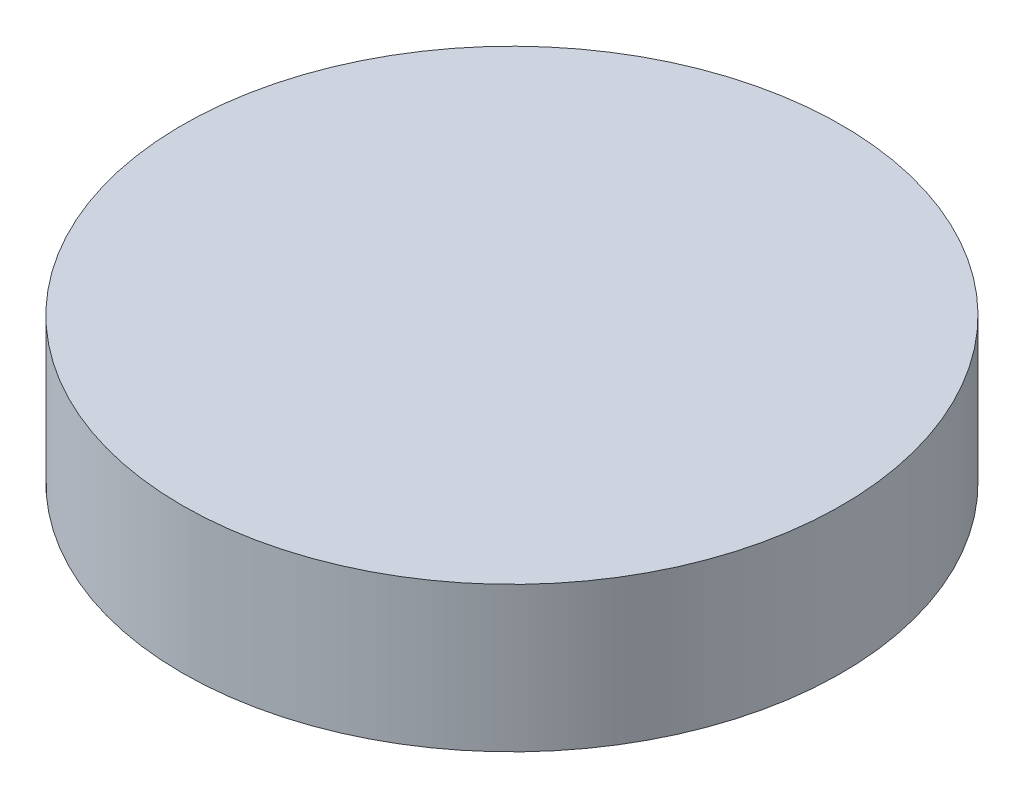
ISO-10303-21;
HEADER;
FILE_DESCRIPTION(('STEP AP214'),'2;1');
FILE_NAME('part.step','',(''),(''),'','','');
FILE_SCHEMA(('AUTOMOTIVE_DESIGN { 1 0 10303 214 1 1 1 1 }'));
ENDSEC;
DATA;
#1=APPLICATION_CONTEXT('core data for automotive mechanical design processes');
#2=APPLICATION_PROTOCOL_DEFINITION('international standard','automotive_design',2000,#1);
#3=PRODUCT_CONTEXT('',#1,'mechanical');
#4=PRODUCT('Part','Part','',(#3));
#5=PRODUCT_RELATED_PRODUCT_CATEGORY('part','',(#4));
#6=PRODUCT_DEFINITION_FORMATION('','',#4);
#7=PRODUCT_DEFINITION_CONTEXT('part definition',#1,'design');
#8=PRODUCT_DEFINITION('design','',#6,#7);
#9=PRODUCT_DEFINITION_SHAPE('','',#8);
#10=(LENGTH_UNIT() NAMED_UNIT(*) SI_UNIT(.MILLI.,.METRE.));
#11=(NAMED_UNIT(*) PLANE_ANGLE_UNIT() SI_UNIT($,.RADIAN.));
#12=(NAMED_UNIT(*) SI_UNIT($,.STERADIAN.) SOLID_ANGLE_UNIT());
#13=UNCERTAINTY_MEASURE_WITH_UNIT(LENGTH_MEASURE(1.E-05),#10,'distance_accuracy_value','');
#14=(GEOMETRIC_REPRESENTATION_CONTEXT(3) GLOBAL_UNCERTAINTY_ASSIGNED_CONTEXT((#13)) GLOBAL_UNIT_ASSIGNED_CONTEXT((#10,
#11,#12)) REPRESENTATION_CONTEXT('',''));
#15=CARTESIAN_POINT('',(0.,0.,0.));
#16=DIRECTION('',(0.,0.,1.));
#17=DIRECTION('',(1.,0.,0.));
#18=AXIS2_PLACEMENT_3D('',#15,#16,#17);
#19=CARTESIAN_POINT('',(0.,32.,0.));
#20=DIRECTION('',(0.,-1.,0.));
#21=DIRECTION('',(0.,0.,-1.));
#22=AXIS2_PLACEMENT_3D('',#19,#20,#21);
#23=CYLINDRICAL_SURFACE('',#22,72.7);
#24=CARTESIAN_POINT('',(0.,32.,0.));
#25=DIRECTION('',(0.,1.,0.));
#26=DIRECTION('',(0.,0.,1.));
#27=AXIS2_PLACEMENT_3D('',#24,#25,#26);
#28=CIRCLE('',#27,72.7);
#29=CARTESIAN_POINT('',(0.,32.,72.7));
#30=VERTEX_POINT('',#29);
#31=EDGE_CURVE('E10',#30,#30,#28,.T.);
#32=ORIENTED_EDGE('',*,*,#31,.F.);
#33=EDGE_LOOP('',(#32));
#34=FACE_BOUND('',#33,.T.);
#35=CARTESIAN_POINT('',(0.,0.,0.));
#36=DIRECTION('',(0.,1.,0.));
#37=DIRECTION('',(0.,0.,1.));
#38=AXIS2_PLACEMENT_3D('',#35,#36,#37);
#39=CIRCLE('',#38,72.7);
#40=CARTESIAN_POINT('',(0.,0.,72.7));
#41=VERTEX_POINT('',#40);
#42=EDGE_CURVE('E37',#41,#41,#39,.T.);
#43=ORIENTED_EDGE('',*,*,#42,.T.);
#44=EDGE_LOOP('',(#43));
#45=FACE_BOUND('',#44,.T.);
#46=ADVANCED_FACE('F34',(#34,#45),#23,.T.);
#47=CARTESIAN_POINT('',(0.,32.,0.));
#48=DIRECTION('',(0.,1.,0.));
#49=DIRECTION('',(0.,0.,1.));
#50=AXIS2_PLACEMENT_3D('',#47,#48,#49);
#51=PLANE('',#50);
#52=ORIENTED_EDGE('',*,*,#31,.T.);
#53=EDGE_LOOP('',(#52));
#54=FACE_BOUND('',#53,.T.);
#55=ADVANCED_FACE('F49',(#54),#51,.T.);
#56=CARTESIAN_POINT('',(0.,0.,0.));
#57=DIRECTION('',(0.,1.,0.));
#58=DIRECTION('',(0.,0.,1.));
#59=AXIS2_PLACEMENT_3D('',#56,#57,#58);
#60=PLANE('',#59);
#61=ORIENTED_EDGE('',*,*,#42,.F.);
#62=EDGE_LOOP('',(#61));
#63=FACE_BOUND('',#62,.T.);
#64=ADVANCED_FACE('F47',(#63),#60,.F.);
#65=CLOSED_SHELL('',(#46,#55,#64));
#66=MANIFOLD_SOLID_BREP('B2',#65);
#67=ADVANCED_BREP_SHAPE_REPRESENTATION('',(#18,#66),#14);
#68=SHAPE_DEFINITION_REPRESENTATION(#9,#67);
ENDSEC;
END-ISO-10303-21;
